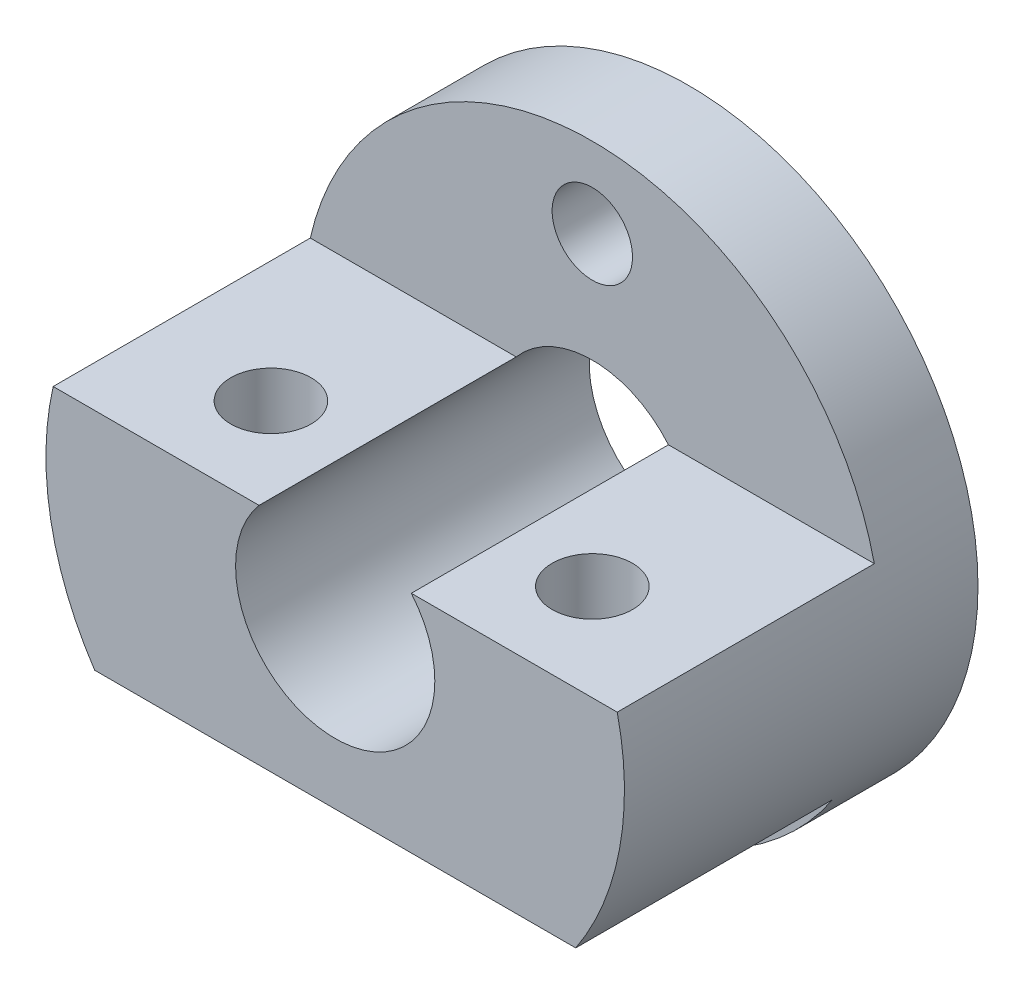
ISO-10303-21;
HEADER;
FILE_DESCRIPTION(('STEP AP214'),'2;1');
FILE_NAME('part.step','',(''),(''),'','','');
FILE_SCHEMA(('AUTOMOTIVE_DESIGN { 1 0 10303 214 1 1 1 1 }'));
ENDSEC;
DATA;
#1=APPLICATION_CONTEXT('core data for automotive mechanical design processes');
#2=APPLICATION_PROTOCOL_DEFINITION('international standard','automotive_design',2000,#1);
#3=PRODUCT_CONTEXT('',#1,'mechanical');
#4=PRODUCT('Part','Part','',(#3));
#5=PRODUCT_RELATED_PRODUCT_CATEGORY('part','',(#4));
#6=PRODUCT_DEFINITION_FORMATION('','',#4);
#7=PRODUCT_DEFINITION_CONTEXT('part definition',#1,'design');
#8=PRODUCT_DEFINITION('design','',#6,#7);
#9=PRODUCT_DEFINITION_SHAPE('','',#8);
#10=(LENGTH_UNIT() NAMED_UNIT(*) SI_UNIT(.MILLI.,.METRE.));
#11=(NAMED_UNIT(*) PLANE_ANGLE_UNIT() SI_UNIT($,.RADIAN.));
#12=(NAMED_UNIT(*) SI_UNIT($,.STERADIAN.) SOLID_ANGLE_UNIT());
#13=UNCERTAINTY_MEASURE_WITH_UNIT(LENGTH_MEASURE(1.E-05),#10,'distance_accuracy_value','');
#14=(GEOMETRIC_REPRESENTATION_CONTEXT(3) GLOBAL_UNCERTAINTY_ASSIGNED_CONTEXT((#13)) GLOBAL_UNIT_ASSIGNED_CONTEXT((#10,
#11,#12)) REPRESENTATION_CONTEXT('',''));
#15=CARTESIAN_POINT('',(0.,0.,0.));
#16=DIRECTION('',(0.,0.,1.));
#17=DIRECTION('',(1.,0.,0.));
#18=AXIS2_PLACEMENT_3D('',#15,#16,#17);
#19=CARTESIAN_POINT('',(0.,0.,3.));
#20=DIRECTION('',(0.,0.,1.));
#21=DIRECTION('',(1.,0.,0.));
#22=AXIS2_PLACEMENT_3D('',#19,#20,#21);
#23=PLANE('',#22);
#24=CARTESIAN_POINT('',(0.,6.5,3.));
#25=DIRECTION('',(0.,0.,1.));
#26=DIRECTION('',(1.,0.,0.));
#27=AXIS2_PLACEMENT_3D('',#24,#25,#26);
#28=CIRCLE('',#27,1.24999999999999);
#29=CARTESIAN_POINT('',(1.24999999999999,6.5,3.));
#30=VERTEX_POINT('',#29);
#31=EDGE_CURVE('E226',#30,#30,#28,.T.);
#32=ORIENTED_EDGE('',*,*,#31,.F.);
#33=EDGE_LOOP('',(#32));
#34=FACE_BOUND('',#33,.T.);
#35=DIRECTION('',(1.,0.,0.));
#36=VECTOR('',#35,1.);
#37=CARTESIAN_POINT('',(-8.77496438739212,2.,3.));
#38=LINE('',#37,#36);
#39=CARTESIAN_POINT('',(2.3685438564654,2.,3.));
#40=VERTEX_POINT('',#39);
#41=CARTESIAN_POINT('',(8.77496438739212,2.,3.));
#42=VERTEX_POINT('',#41);
#43=EDGE_CURVE('E111',#40,#42,#38,.T.);
#44=ORIENTED_EDGE('',*,*,#43,.T.);
#45=CARTESIAN_POINT('',(0.,0.,3.));
#46=DIRECTION('',(0.,0.,1.));
#47=DIRECTION('',(1.,0.,0.));
#48=AXIS2_PLACEMENT_3D('',#45,#46,#47);
#49=CIRCLE('',#48,9.);
#50=CARTESIAN_POINT('',(-8.77496438739212,2.,3.));
#51=VERTEX_POINT('',#50);
#52=EDGE_CURVE('E107',#42,#51,#49,.T.);
#53=ORIENTED_EDGE('',*,*,#52,.T.);
#54=CARTESIAN_POINT('',(-2.3685438564654,2.,3.));
#55=VERTEX_POINT('',#54);
#56=EDGE_CURVE('E109',#51,#55,#38,.T.);
#57=ORIENTED_EDGE('',*,*,#56,.T.);
#58=CARTESIAN_POINT('',(0.,0.,3.));
#59=DIRECTION('',(0.,0.,1.));
#60=DIRECTION('',(1.,0.,0.));
#61=AXIS2_PLACEMENT_3D('',#58,#59,#60);
#62=CIRCLE('',#61,3.1);
#63=EDGE_CURVE('E170',#40,#55,#62,.T.);
#64=ORIENTED_EDGE('',*,*,#63,.F.);
#65=EDGE_LOOP('',(#44,#53,#57,#64));
#66=FACE_BOUND('',#65,.T.);
#67=ADVANCED_FACE('F50',(#34,#66),#23,.T.);
#68=CARTESIAN_POINT('',(0.,-6.5,3.));
#69=DIRECTION('',(0.,0.,1.));
#70=DIRECTION('',(1.,0.,0.));
#71=AXIS2_PLACEMENT_3D('',#68,#69,#70);
#72=CIRCLE('',#71,1.24999999999999);
#73=CARTESIAN_POINT('',(1.24999999999999,-6.5,3.));
#74=VERTEX_POINT('',#73);
#75=EDGE_CURVE('E218',#74,#74,#72,.T.);
#76=ORIENTED_EDGE('',*,*,#75,.F.);
#77=EDGE_LOOP('',(#76));
#78=FACE_BOUND('',#77,.T.);
#79=DIRECTION('',(-1.,0.,0.));
#80=VECTOR('',#79,1.);
#81=CARTESIAN_POINT('',(-7.48331477354788,-5.,3.));
#82=LINE('',#81,#80);
#83=CARTESIAN_POINT('',(7.48331477354788,-5.,3.));
#84=VERTEX_POINT('',#83);
#85=CARTESIAN_POINT('',(-7.48331477354788,-5.,3.));
#86=VERTEX_POINT('',#85);
#87=EDGE_CURVE('E141',#84,#86,#82,.T.);
#88=ORIENTED_EDGE('',*,*,#87,.T.);
#89=EDGE_CURVE('E118',#86,#84,#49,.T.);
#90=ORIENTED_EDGE('',*,*,#89,.T.);
#91=EDGE_LOOP('',(#88,#90));
#92=FACE_BOUND('',#91,.T.);
#93=ADVANCED_FACE('F194',(#78,#92),#23,.T.);
#94=CARTESIAN_POINT('',(0.,0.,0.));
#95=DIRECTION('',(0.,0.,1.));
#96=DIRECTION('',(1.,0.,0.));
#97=AXIS2_PLACEMENT_3D('',#94,#95,#96);
#98=PLANE('',#97);
#99=CARTESIAN_POINT('',(0.,6.5,0.));
#100=DIRECTION('',(0.,0.,1.));
#101=DIRECTION('',(1.,0.,0.));
#102=AXIS2_PLACEMENT_3D('',#99,#100,#101);
#103=CIRCLE('',#102,1.25);
#104=CARTESIAN_POINT('',(1.25,6.5,0.));
#105=VERTEX_POINT('',#104);
#106=EDGE_CURVE('E222',#105,#105,#103,.T.);
#107=ORIENTED_EDGE('',*,*,#106,.T.);
#108=EDGE_LOOP('',(#107));
#109=FACE_BOUND('',#108,.T.);
#110=CARTESIAN_POINT('',(0.,-6.5,0.));
#111=DIRECTION('',(0.,0.,1.));
#112=DIRECTION('',(1.,0.,0.));
#113=AXIS2_PLACEMENT_3D('',#110,#111,#112);
#114=CIRCLE('',#113,1.25);
#115=CARTESIAN_POINT('',(1.25,-6.5,0.));
#116=VERTEX_POINT('',#115);
#117=EDGE_CURVE('E214',#116,#116,#114,.T.);
#118=ORIENTED_EDGE('',*,*,#117,.T.);
#119=EDGE_LOOP('',(#118));
#120=FACE_BOUND('',#119,.T.);
#121=CARTESIAN_POINT('',(0.,0.,0.));
#122=DIRECTION('',(0.,0.,1.));
#123=DIRECTION('',(1.,0.,0.));
#124=AXIS2_PLACEMENT_3D('',#121,#122,#123);
#125=CIRCLE('',#124,3.1);
#126=CARTESIAN_POINT('',(3.1,0.,0.));
#127=VERTEX_POINT('',#126);
#128=EDGE_CURVE('E145',#127,#127,#125,.T.);
#129=ORIENTED_EDGE('',*,*,#128,.T.);
#130=EDGE_LOOP('',(#129));
#131=FACE_BOUND('',#130,.T.);
#132=CARTESIAN_POINT('',(0.,0.,0.));
#133=DIRECTION('',(0.,0.,1.));
#134=DIRECTION('',(1.,0.,0.));
#135=AXIS2_PLACEMENT_3D('',#132,#133,#134);
#136=CIRCLE('',#135,9.);
#137=CARTESIAN_POINT('',(9.,0.,0.));
#138=VERTEX_POINT('',#137);
#139=EDGE_CURVE('E117',#138,#138,#136,.T.);
#140=ORIENTED_EDGE('',*,*,#139,.F.);
#141=EDGE_LOOP('',(#140));
#142=FACE_BOUND('',#141,.T.);
#143=ADVANCED_FACE('F52',(#109,#120,#131,#142),#98,.F.);
#144=CARTESIAN_POINT('',(-8.77496438739212,2.,3.));
#145=DIRECTION('',(0.,-1.,0.));
#146=DIRECTION('',(0.,0.,-1.));
#147=AXIS2_PLACEMENT_3D('',#144,#145,#146);
#148=PLANE('',#147);
#149=CARTESIAN_POINT('',(5.,2.,8.));
#150=DIRECTION('',(0.,1.,0.));
#151=DIRECTION('',(0.,0.,1.));
#152=AXIS2_PLACEMENT_3D('',#149,#150,#151);
#153=CIRCLE('',#152,1.24999999999999);
#154=CARTESIAN_POINT('',(5.,2.,9.24999999999999));
#155=VERTEX_POINT('',#154);
#156=EDGE_CURVE('E198',#155,#155,#153,.T.);
#157=ORIENTED_EDGE('',*,*,#156,.F.);
#158=EDGE_LOOP('',(#157));
#159=FACE_BOUND('',#158,.T.);
#160=DIRECTION('',(-1.,0.,0.));
#161=VECTOR('',#160,1.);
#162=CARTESIAN_POINT('',(-8.77496438739212,2.,11.));
#163=LINE('',#162,#161);
#164=CARTESIAN_POINT('',(8.77496438739212,2.,11.));
#165=VERTEX_POINT('',#164);
#166=CARTESIAN_POINT('',(2.3685438564654,2.,11.));
#167=VERTEX_POINT('',#166);
#168=EDGE_CURVE('E67',#165,#167,#163,.T.);
#169=ORIENTED_EDGE('',*,*,#168,.F.);
#170=DIRECTION('',(0.,0.,1.));
#171=VECTOR('',#170,1.);
#172=CARTESIAN_POINT('',(8.77496438739212,2.,3.));
#173=LINE('',#172,#171);
#174=EDGE_CURVE('E132',#42,#165,#173,.T.);
#175=ORIENTED_EDGE('',*,*,#174,.F.);
#176=ORIENTED_EDGE('',*,*,#43,.F.);
#177=DIRECTION('',(0.,0.,1.));
#178=VECTOR('',#177,1.);
#179=CARTESIAN_POINT('',(2.3685438564654,2.,-4.));
#180=LINE('',#179,#178);
#181=EDGE_CURVE('E60',#40,#167,#180,.T.);
#182=ORIENTED_EDGE('',*,*,#181,.T.);
#183=EDGE_LOOP('',(#169,#175,#176,#182));
#184=FACE_BOUND('',#183,.T.);
#185=ADVANCED_FACE('F185',(#159,#184),#148,.F.);
#186=CARTESIAN_POINT('',(0.,0.,16.));
#187=DIRECTION('',(0.,0.,-1.));
#188=DIRECTION('',(-1.,0.,0.));
#189=AXIS2_PLACEMENT_3D('',#186,#187,#188);
#190=CYLINDRICAL_SURFACE('',#189,9.);
#191=CARTESIAN_POINT('',(0.,0.,11.));
#192=DIRECTION('',(0.,0.,1.));
#193=DIRECTION('',(1.,0.,0.));
#194=AXIS2_PLACEMENT_3D('',#191,#192,#193);
#195=CIRCLE('',#194,9.);
#196=CARTESIAN_POINT('',(7.48331477354788,-5.,11.));
#197=VERTEX_POINT('',#196);
#198=EDGE_CURVE('E155',#197,#165,#195,.T.);
#199=ORIENTED_EDGE('',*,*,#198,.F.);
#200=DIRECTION('',(0.,0.,1.));
#201=VECTOR('',#200,1.);
#202=CARTESIAN_POINT('',(7.48331477354788,-5.,3.));
#203=LINE('',#202,#201);
#204=EDGE_CURVE('E137',#84,#197,#203,.T.);
#205=ORIENTED_EDGE('',*,*,#204,.F.);
#206=ORIENTED_EDGE('',*,*,#89,.F.);
#207=DIRECTION('',(0.,0.,1.));
#208=VECTOR('',#207,1.);
#209=CARTESIAN_POINT('',(-7.48331477354788,-5.,3.));
#210=LINE('',#209,#208);
#211=CARTESIAN_POINT('',(-7.48331477354788,-5.,11.));
#212=VERTEX_POINT('',#211);
#213=EDGE_CURVE('E142',#86,#212,#210,.T.);
#214=ORIENTED_EDGE('',*,*,#213,.T.);
#215=CARTESIAN_POINT('',(-8.77496438739212,2.,11.));
#216=VERTEX_POINT('',#215);
#217=EDGE_CURVE('E130',#216,#212,#195,.T.);
#218=ORIENTED_EDGE('',*,*,#217,.F.);
#219=DIRECTION('',(0.,0.,1.));
#220=VECTOR('',#219,1.);
#221=CARTESIAN_POINT('',(-8.77496438739212,2.,3.));
#222=LINE('',#221,#220);
#223=EDGE_CURVE('E122',#51,#216,#222,.T.);
#224=ORIENTED_EDGE('',*,*,#223,.F.);
#225=ORIENTED_EDGE('',*,*,#52,.F.);
#226=ORIENTED_EDGE('',*,*,#174,.T.);
#227=EDGE_LOOP('',(#199,#205,#206,#214,#218,#224,#225,#226));
#228=FACE_BOUND('',#227,.T.);
#229=ORIENTED_EDGE('',*,*,#139,.T.);
#230=EDGE_LOOP('',(#229));
#231=FACE_BOUND('',#230,.T.);
#232=ADVANCED_FACE('F127',(#228,#231),#190,.T.);
#233=CARTESIAN_POINT('',(-7.48331477354788,-5.,3.));
#234=DIRECTION('',(0.,1.,0.));
#235=DIRECTION('',(0.,0.,1.));
#236=AXIS2_PLACEMENT_3D('',#233,#234,#235);
#237=PLANE('',#236);
#238=CARTESIAN_POINT('',(-5.,-5.,8.));
#239=DIRECTION('',(0.,1.,0.));
#240=DIRECTION('',(0.,0.,1.));
#241=AXIS2_PLACEMENT_3D('',#238,#239,#240);
#242=CIRCLE('',#241,1.24999999999999);
#243=CARTESIAN_POINT('',(-5.,-5.,9.24999999999999));
#244=VERTEX_POINT('',#243);
#245=EDGE_CURVE('E203',#244,#244,#242,.T.);
#246=ORIENTED_EDGE('',*,*,#245,.T.);
#247=EDGE_LOOP('',(#246));
#248=FACE_BOUND('',#247,.T.);
#249=CARTESIAN_POINT('',(5.,-5.,8.));
#250=DIRECTION('',(0.,1.,0.));
#251=DIRECTION('',(0.,0.,1.));
#252=AXIS2_PLACEMENT_3D('',#249,#250,#251);
#253=CIRCLE('',#252,1.24999999999999);
#254=CARTESIAN_POINT('',(5.,-5.,9.24999999999999));
#255=VERTEX_POINT('',#254);
#256=EDGE_CURVE('E54',#255,#255,#253,.T.);
#257=ORIENTED_EDGE('',*,*,#256,.T.);
#258=EDGE_LOOP('',(#257));
#259=FACE_BOUND('',#258,.T.);
#260=DIRECTION('',(1.,0.,0.));
#261=VECTOR('',#260,1.);
#262=CARTESIAN_POINT('',(-7.48331477354788,-5.,11.));
#263=LINE('',#262,#261);
#264=EDGE_CURVE('E167',#212,#197,#263,.T.);
#265=ORIENTED_EDGE('',*,*,#264,.F.);
#266=ORIENTED_EDGE('',*,*,#213,.F.);
#267=ORIENTED_EDGE('',*,*,#87,.F.);
#268=ORIENTED_EDGE('',*,*,#204,.T.);
#269=EDGE_LOOP('',(#265,#266,#267,#268));
#270=FACE_BOUND('',#269,.T.);
#271=ADVANCED_FACE('F191',(#248,#259,#270),#237,.F.);
#272=CARTESIAN_POINT('',(-5.,2.,8.));
#273=DIRECTION('',(0.,1.,0.));
#274=DIRECTION('',(0.,0.,1.));
#275=AXIS2_PLACEMENT_3D('',#272,#273,#274);
#276=CIRCLE('',#275,1.24999999999999);
#277=CARTESIAN_POINT('',(-5.,2.,9.24999999999999));
#278=VERTEX_POINT('',#277);
#279=EDGE_CURVE('E208',#278,#278,#276,.T.);
#280=ORIENTED_EDGE('',*,*,#279,.F.);
#281=EDGE_LOOP('',(#280));
#282=FACE_BOUND('',#281,.T.);
#283=DIRECTION('',(-1.,0.,0.));
#284=VECTOR('',#283,1.);
#285=CARTESIAN_POINT('',(-8.77496438739212,2.,11.));
#286=LINE('',#285,#284);
#287=CARTESIAN_POINT('',(-2.3685438564654,2.,11.));
#288=VERTEX_POINT('',#287);
#289=EDGE_CURVE('E160',#288,#216,#286,.T.);
#290=ORIENTED_EDGE('',*,*,#289,.F.);
#291=DIRECTION('',(0.,0.,1.));
#292=VECTOR('',#291,1.);
#293=CARTESIAN_POINT('',(-2.3685438564654,2.,-4.));
#294=LINE('',#293,#292);
#295=EDGE_CURVE('E75',#288,#55,#294,.F.);
#296=ORIENTED_EDGE('',*,*,#295,.T.);
#297=ORIENTED_EDGE('',*,*,#56,.F.);
#298=ORIENTED_EDGE('',*,*,#223,.T.);
#299=EDGE_LOOP('',(#290,#296,#297,#298));
#300=FACE_BOUND('',#299,.T.);
#301=ADVANCED_FACE('F121',(#282,#300),#148,.F.);
#302=CARTESIAN_POINT('',(0.,0.,-4.));
#303=DIRECTION('',(0.,0.,1.));
#304=DIRECTION('',(1.,0.,0.));
#305=AXIS2_PLACEMENT_3D('',#302,#303,#304);
#306=CYLINDRICAL_SURFACE('',#305,3.1);
#307=ORIENTED_EDGE('',*,*,#128,.F.);
#308=EDGE_LOOP('',(#307));
#309=FACE_BOUND('',#308,.T.);
#310=CARTESIAN_POINT('',(0.,0.,11.));
#311=DIRECTION('',(0.,0.,1.));
#312=DIRECTION('',(1.,0.,0.));
#313=AXIS2_PLACEMENT_3D('',#310,#311,#312);
#314=CIRCLE('',#313,3.1);
#315=EDGE_CURVE('E12',#167,#288,#314,.F.);
#316=ORIENTED_EDGE('',*,*,#315,.F.);
#317=ORIENTED_EDGE('',*,*,#181,.F.);
#318=ORIENTED_EDGE('',*,*,#63,.T.);
#319=ORIENTED_EDGE('',*,*,#295,.F.);
#320=EDGE_LOOP('',(#316,#317,#318,#319));
#321=FACE_BOUND('',#320,.T.);
#322=ADVANCED_FACE('F179',(#309,#321),#306,.F.);
#323=CARTESIAN_POINT('',(0.,0.,11.));
#324=DIRECTION('',(0.,0.,1.));
#325=DIRECTION('',(1.,0.,0.));
#326=AXIS2_PLACEMENT_3D('',#323,#324,#325);
#327=PLANE('',#326);
#328=ORIENTED_EDGE('',*,*,#264,.T.);
#329=ORIENTED_EDGE('',*,*,#198,.T.);
#330=ORIENTED_EDGE('',*,*,#168,.T.);
#331=ORIENTED_EDGE('',*,*,#315,.T.);
#332=ORIENTED_EDGE('',*,*,#289,.T.);
#333=ORIENTED_EDGE('',*,*,#217,.T.);
#334=EDGE_LOOP('',(#328,#329,#330,#331,#332,#333));
#335=FACE_BOUND('',#334,.T.);
#336=ADVANCED_FACE('F182',(#335),#327,.T.);
#337=CARTESIAN_POINT('',(5.,2.,8.));
#338=DIRECTION('',(0.,1.,0.));
#339=DIRECTION('',(0.,0.,1.));
#340=AXIS2_PLACEMENT_3D('',#337,#338,#339);
#341=CYLINDRICAL_SURFACE('',#340,1.24999999999999);
#342=ORIENTED_EDGE('',*,*,#156,.T.);
#343=EDGE_LOOP('',(#342));
#344=FACE_BOUND('',#343,.T.);
#345=ORIENTED_EDGE('',*,*,#256,.F.);
#346=EDGE_LOOP('',(#345));
#347=FACE_BOUND('',#346,.T.);
#348=ADVANCED_FACE('F250',(#344,#347),#341,.F.);
#349=CARTESIAN_POINT('',(-5.,2.,8.));
#350=DIRECTION('',(0.,1.,0.));
#351=DIRECTION('',(0.,0.,1.));
#352=AXIS2_PLACEMENT_3D('',#349,#350,#351);
#353=CYLINDRICAL_SURFACE('',#352,1.24999999999999);
#354=ORIENTED_EDGE('',*,*,#279,.T.);
#355=EDGE_LOOP('',(#354));
#356=FACE_BOUND('',#355,.T.);
#357=ORIENTED_EDGE('',*,*,#245,.F.);
#358=EDGE_LOOP('',(#357));
#359=FACE_BOUND('',#358,.T.);
#360=ADVANCED_FACE('F253',(#356,#359),#353,.F.);
#361=CARTESIAN_POINT('',(0.,-6.5,3.));
#362=DIRECTION('',(0.,0.,1.));
#363=DIRECTION('',(1.,0.,0.));
#364=AXIS2_PLACEMENT_3D('',#361,#362,#363);
#365=CYLINDRICAL_SURFACE('',#364,1.24999999999999);
#366=ORIENTED_EDGE('',*,*,#117,.F.);
#367=EDGE_LOOP('',(#366));
#368=FACE_BOUND('',#367,.T.);
#369=ORIENTED_EDGE('',*,*,#75,.T.);
#370=EDGE_LOOP('',(#369));
#371=FACE_BOUND('',#370,.T.);
#372=ADVANCED_FACE('F256',(#368,#371),#365,.F.);
#373=CARTESIAN_POINT('',(0.,6.5,3.));
#374=DIRECTION('',(0.,0.,1.));
#375=DIRECTION('',(1.,0.,0.));
#376=AXIS2_PLACEMENT_3D('',#373,#374,#375);
#377=CYLINDRICAL_SURFACE('',#376,1.24999999999999);
#378=ORIENTED_EDGE('',*,*,#106,.F.);
#379=EDGE_LOOP('',(#378));
#380=FACE_BOUND('',#379,.T.);
#381=ORIENTED_EDGE('',*,*,#31,.T.);
#382=EDGE_LOOP('',(#381));
#383=FACE_BOUND('',#382,.T.);
#384=ADVANCED_FACE('F231',(#380,#383),#377,.F.);
#385=CLOSED_SHELL('',(#67,#93,#143,#185,#232,#271,#301,#322,#336,#348,#360,#372,#384));
#386=MANIFOLD_SOLID_BREP('B2',#385);
#387=ADVANCED_BREP_SHAPE_REPRESENTATION('',(#18,#386),#14);
#388=SHAPE_DEFINITION_REPRESENTATION(#9,#387);
ENDSEC;
END-ISO-10303-21;
